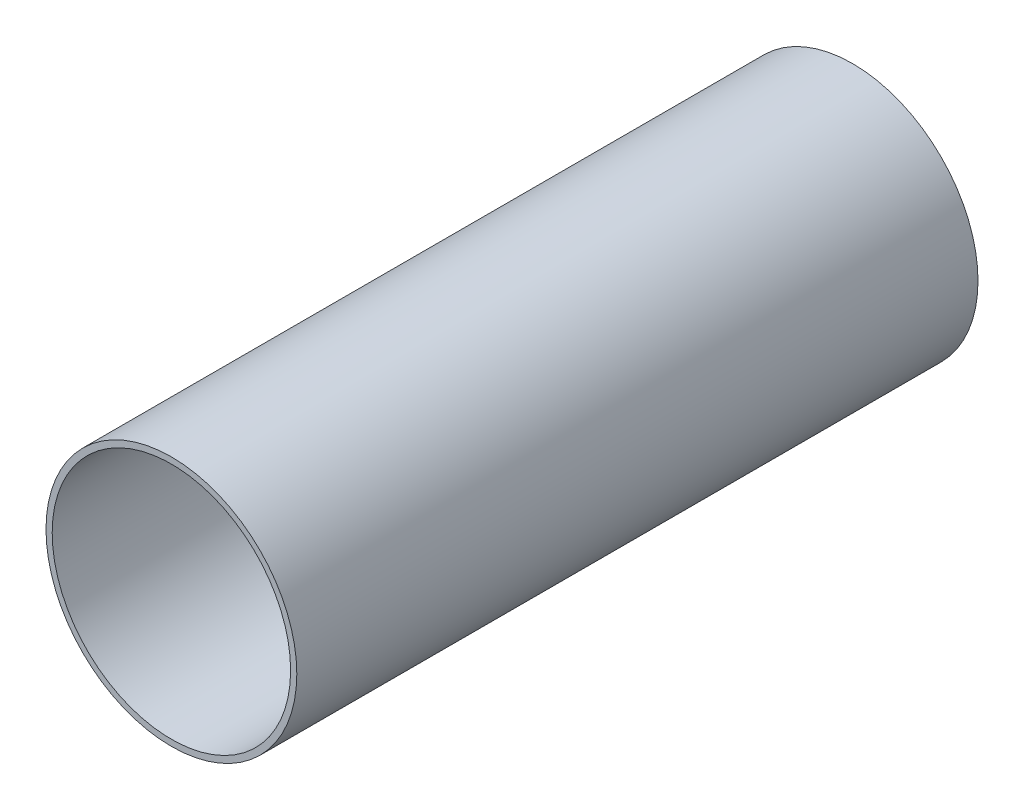
ISO-10303-21;
HEADER;
FILE_DESCRIPTION(('STEP AP214'),'2;1');
FILE_NAME('part.step','',(''),(''),'','','');
FILE_SCHEMA(('AUTOMOTIVE_DESIGN { 1 0 10303 214 1 1 1 1 }'));
ENDSEC;
DATA;
#1=APPLICATION_CONTEXT('core data for automotive mechanical design processes');
#2=APPLICATION_PROTOCOL_DEFINITION('international standard','automotive_design',2000,#1);
#3=PRODUCT_CONTEXT('',#1,'mechanical');
#4=PRODUCT('Part','Part','',(#3));
#5=PRODUCT_RELATED_PRODUCT_CATEGORY('part','',(#4));
#6=PRODUCT_DEFINITION_FORMATION('','',#4);
#7=PRODUCT_DEFINITION_CONTEXT('part definition',#1,'design');
#8=PRODUCT_DEFINITION('design','',#6,#7);
#9=PRODUCT_DEFINITION_SHAPE('','',#8);
#10=(LENGTH_UNIT() NAMED_UNIT(*) SI_UNIT(.MILLI.,.METRE.));
#11=(NAMED_UNIT(*) PLANE_ANGLE_UNIT() SI_UNIT($,.RADIAN.));
#12=(NAMED_UNIT(*) SI_UNIT($,.STERADIAN.) SOLID_ANGLE_UNIT());
#13=UNCERTAINTY_MEASURE_WITH_UNIT(LENGTH_MEASURE(1.E-05),#10,'distance_accuracy_value','');
#14=(GEOMETRIC_REPRESENTATION_CONTEXT(3) GLOBAL_UNCERTAINTY_ASSIGNED_CONTEXT((#13)) GLOBAL_UNIT_ASSIGNED_CONTEXT((#10,
#11,#12)) REPRESENTATION_CONTEXT('',''));
#15=CARTESIAN_POINT('',(0.,0.,0.));
#16=DIRECTION('',(0.,0.,1.));
#17=DIRECTION('',(1.,0.,0.));
#18=AXIS2_PLACEMENT_3D('',#15,#16,#17);
#19=CARTESIAN_POINT('',(0.,0.,110.));
#20=DIRECTION('',(0.,0.,1.));
#21=DIRECTION('',(1.,0.,0.));
#22=AXIS2_PLACEMENT_3D('',#19,#20,#21);
#23=PLANE('',#22);
#24=CARTESIAN_POINT('',(0.,0.,110.));
#25=DIRECTION('',(0.,0.,1.));
#26=DIRECTION('',(1.,0.,0.));
#27=AXIS2_PLACEMENT_3D('',#24,#25,#26);
#28=CIRCLE('',#27,20.25);
#29=CARTESIAN_POINT('',(20.25,0.,110.));
#30=VERTEX_POINT('',#29);
#31=EDGE_CURVE('E10',#30,#30,#28,.T.);
#32=ORIENTED_EDGE('',*,*,#31,.T.);
#33=EDGE_LOOP('',(#32));
#34=FACE_BOUND('',#33,.T.);
#35=CARTESIAN_POINT('',(0.,0.,110.));
#36=DIRECTION('',(0.,0.,1.));
#37=DIRECTION('',(1.,0.,0.));
#38=AXIS2_PLACEMENT_3D('',#35,#36,#37);
#39=CIRCLE('',#38,19.25);
#40=CARTESIAN_POINT('',(19.25,0.,110.));
#41=VERTEX_POINT('',#40);
#42=EDGE_CURVE('E42',#41,#41,#39,.T.);
#43=ORIENTED_EDGE('',*,*,#42,.F.);
#44=EDGE_LOOP('',(#43));
#45=FACE_BOUND('',#44,.T.);
#46=ADVANCED_FACE('F31',(#34,#45),#23,.T.);
#47=CARTESIAN_POINT('',(0.,0.,0.));
#48=DIRECTION('',(0.,0.,1.));
#49=DIRECTION('',(1.,0.,0.));
#50=AXIS2_PLACEMENT_3D('',#47,#48,#49);
#51=PLANE('',#50);
#52=CARTESIAN_POINT('',(0.,0.,0.));
#53=DIRECTION('',(0.,0.,1.));
#54=DIRECTION('',(1.,0.,0.));
#55=AXIS2_PLACEMENT_3D('',#52,#53,#54);
#56=CIRCLE('',#55,20.25);
#57=CARTESIAN_POINT('',(20.25,0.,0.));
#58=VERTEX_POINT('',#57);
#59=EDGE_CURVE('E35',#58,#58,#56,.T.);
#60=ORIENTED_EDGE('',*,*,#59,.F.);
#61=EDGE_LOOP('',(#60));
#62=FACE_BOUND('',#61,.T.);
#63=CARTESIAN_POINT('',(0.,0.,0.));
#64=DIRECTION('',(0.,0.,1.));
#65=DIRECTION('',(1.,0.,0.));
#66=AXIS2_PLACEMENT_3D('',#63,#64,#65);
#67=CIRCLE('',#66,19.25);
#68=CARTESIAN_POINT('',(19.25,0.,0.));
#69=VERTEX_POINT('',#68);
#70=EDGE_CURVE('E44',#69,#69,#67,.T.);
#71=ORIENTED_EDGE('',*,*,#70,.T.);
#72=EDGE_LOOP('',(#71));
#73=FACE_BOUND('',#72,.T.);
#74=ADVANCED_FACE('F54',(#62,#73),#51,.F.);
#75=CARTESIAN_POINT('',(0.,0.,110.));
#76=DIRECTION('',(0.,0.,-1.));
#77=DIRECTION('',(-1.,0.,0.));
#78=AXIS2_PLACEMENT_3D('',#75,#76,#77);
#79=CYLINDRICAL_SURFACE('',#78,20.25);
#80=ORIENTED_EDGE('',*,*,#31,.F.);
#81=EDGE_LOOP('',(#80));
#82=FACE_BOUND('',#81,.T.);
#83=ORIENTED_EDGE('',*,*,#59,.T.);
#84=EDGE_LOOP('',(#83));
#85=FACE_BOUND('',#84,.T.);
#86=ADVANCED_FACE('F33',(#82,#85),#79,.T.);
#87=CARTESIAN_POINT('',(0.,0.,110.));
#88=DIRECTION('',(0.,0.,-1.));
#89=DIRECTION('',(-1.,0.,0.));
#90=AXIS2_PLACEMENT_3D('',#87,#88,#89);
#91=CYLINDRICAL_SURFACE('',#90,19.25);
#92=ORIENTED_EDGE('',*,*,#42,.T.);
#93=EDGE_LOOP('',(#92));
#94=FACE_BOUND('',#93,.T.);
#95=ORIENTED_EDGE('',*,*,#70,.F.);
#96=EDGE_LOOP('',(#95));
#97=FACE_BOUND('',#96,.T.);
#98=ADVANCED_FACE('F50',(#94,#97),#91,.F.);
#99=CLOSED_SHELL('',(#46,#74,#86,#98));
#100=MANIFOLD_SOLID_BREP('B2',#99);
#101=ADVANCED_BREP_SHAPE_REPRESENTATION('',(#18,#100),#14);
#102=SHAPE_DEFINITION_REPRESENTATION(#9,#101);
ENDSEC;
END-ISO-10303-21;
